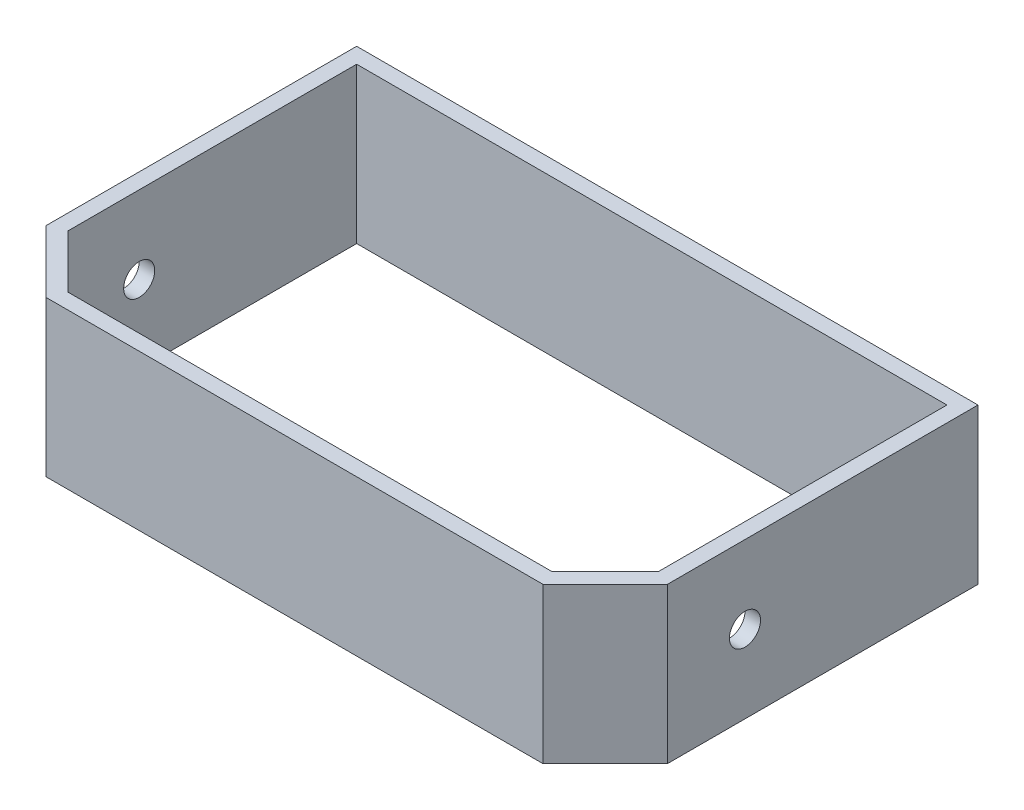
ISO-10303-21;
HEADER;
FILE_DESCRIPTION(('STEP AP214'),'2;1');
FILE_NAME('part.step','',(''),(''),'','','');
FILE_SCHEMA(('AUTOMOTIVE_DESIGN { 1 0 10303 214 1 1 1 1 }'));
ENDSEC;
DATA;
#1=APPLICATION_CONTEXT('core data for automotive mechanical design processes');
#2=APPLICATION_PROTOCOL_DEFINITION('international standard','automotive_design',2000,#1);
#3=PRODUCT_CONTEXT('',#1,'mechanical');
#4=PRODUCT('Part','Part','',(#3));
#5=PRODUCT_RELATED_PRODUCT_CATEGORY('part','',(#4));
#6=PRODUCT_DEFINITION_FORMATION('','',#4);
#7=PRODUCT_DEFINITION_CONTEXT('part definition',#1,'design');
#8=PRODUCT_DEFINITION('design','',#6,#7);
#9=PRODUCT_DEFINITION_SHAPE('','',#8);
#10=(LENGTH_UNIT() NAMED_UNIT(*) SI_UNIT(.MILLI.,.METRE.));
#11=(NAMED_UNIT(*) PLANE_ANGLE_UNIT() SI_UNIT($,.RADIAN.));
#12=(NAMED_UNIT(*) SI_UNIT($,.STERADIAN.) SOLID_ANGLE_UNIT());
#13=UNCERTAINTY_MEASURE_WITH_UNIT(LENGTH_MEASURE(1.E-05),#10,'distance_accuracy_value','');
#14=(GEOMETRIC_REPRESENTATION_CONTEXT(3) GLOBAL_UNCERTAINTY_ASSIGNED_CONTEXT((#13)) GLOBAL_UNIT_ASSIGNED_CONTEXT((#10,
#11,#12)) REPRESENTATION_CONTEXT('',''));
#15=CARTESIAN_POINT('',(0.,0.,0.));
#16=DIRECTION('',(0.,0.,1.));
#17=DIRECTION('',(1.,0.,0.));
#18=AXIS2_PLACEMENT_3D('',#15,#16,#17);
#19=CARTESIAN_POINT('',(0.,15.875,0.));
#20=DIRECTION('',(0.,1.,0.));
#21=DIRECTION('',(0.,0.,1.));
#22=AXIS2_PLACEMENT_3D('',#19,#20,#21);
#23=PLANE('',#22);
#24=DIRECTION('',(0.,0.,1.));
#25=VECTOR('',#24,1.);
#26=CARTESIAN_POINT('',(-63.5,15.875,-12.6999999999999));
#27=LINE('',#26,#25);
#28=CARTESIAN_POINT('',(-63.5,15.875,-76.2));
#29=VERTEX_POINT('',#28);
#30=CARTESIAN_POINT('',(-63.5,15.875,-12.6999999999999));
#31=VERTEX_POINT('',#30);
#32=EDGE_CURVE('E175',#29,#31,#27,.T.);
#33=ORIENTED_EDGE('',*,*,#32,.T.);
#34=DIRECTION('',(0.707106781186551,0.,0.707106781186544));
#35=VECTOR('',#34,1.);
#36=CARTESIAN_POINT('',(-50.8,15.875,0.));
#37=LINE('',#36,#35);
#38=CARTESIAN_POINT('',(-50.8,15.875,0.));
#39=VERTEX_POINT('',#38);
#40=EDGE_CURVE('E178',#31,#39,#37,.T.);
#41=ORIENTED_EDGE('',*,*,#40,.T.);
#42=DIRECTION('',(1.,0.,0.));
#43=VECTOR('',#42,1.);
#44=CARTESIAN_POINT('',(-50.8,15.875,0.));
#45=LINE('',#44,#43);
#46=CARTESIAN_POINT('',(50.8,15.875,0.));
#47=VERTEX_POINT('',#46);
#48=EDGE_CURVE('E181',#39,#47,#45,.T.);
#49=ORIENTED_EDGE('',*,*,#48,.T.);
#50=DIRECTION('',(0.707106781186552,0.,-0.707106781186543));
#51=VECTOR('',#50,1.);
#52=CARTESIAN_POINT('',(50.8,15.875,0.));
#53=LINE('',#52,#51);
#54=CARTESIAN_POINT('',(63.5,15.875,-12.6999999999999));
#55=VERTEX_POINT('',#54);
#56=EDGE_CURVE('E183',#47,#55,#53,.T.);
#57=ORIENTED_EDGE('',*,*,#56,.T.);
#58=DIRECTION('',(0.,0.,-1.));
#59=VECTOR('',#58,1.);
#60=CARTESIAN_POINT('',(63.5,15.875,-12.6999999999999));
#61=LINE('',#60,#59);
#62=CARTESIAN_POINT('',(63.5,15.875,-76.2));
#63=VERTEX_POINT('',#62);
#64=EDGE_CURVE('E185',#55,#63,#61,.T.);
#65=ORIENTED_EDGE('',*,*,#64,.T.);
#66=DIRECTION('',(-1.,0.,0.));
#67=VECTOR('',#66,1.);
#68=CARTESIAN_POINT('',(63.5,15.875,-76.2));
#69=LINE('',#68,#67);
#70=EDGE_CURVE('E187',#63,#29,#69,.T.);
#71=ORIENTED_EDGE('',*,*,#70,.T.);
#72=EDGE_LOOP('',(#33,#41,#49,#57,#65,#71));
#73=FACE_BOUND('',#72,.T.);
#74=DIRECTION('',(-1.,0.,0.));
#75=VECTOR('',#74,1.);
#76=CARTESIAN_POINT('',(60.325,15.875,-73.025));
#77=LINE('',#76,#75);
#78=CARTESIAN_POINT('',(60.325,15.875,-73.025));
#79=VERTEX_POINT('',#78);
#80=CARTESIAN_POINT('',(-60.325,15.875,-73.025));
#81=VERTEX_POINT('',#80);
#82=EDGE_CURVE('E130',#79,#81,#77,.T.);
#83=ORIENTED_EDGE('',*,*,#82,.F.);
#84=DIRECTION('',(0.,0.,-1.));
#85=VECTOR('',#84,1.);
#86=CARTESIAN_POINT('',(60.325,15.875,-14.0151280605346));
#87=LINE('',#86,#85);
#88=CARTESIAN_POINT('',(60.325,15.875,-14.0151280605346));
#89=VERTEX_POINT('',#88);
#90=EDGE_CURVE('E122',#89,#79,#87,.T.);
#91=ORIENTED_EDGE('',*,*,#90,.F.);
#92=DIRECTION('',(0.707106781186548,0.,-0.707106781186547));
#93=VECTOR('',#92,1.);
#94=CARTESIAN_POINT('',(49.4848719394654,15.875,-3.175));
#95=LINE('',#94,#93);
#96=CARTESIAN_POINT('',(49.4848719394654,15.875,-3.175));
#97=VERTEX_POINT('',#96);
#98=EDGE_CURVE('E152',#97,#89,#95,.T.);
#99=ORIENTED_EDGE('',*,*,#98,.F.);
#100=DIRECTION('',(1.,0.,0.));
#101=VECTOR('',#100,1.);
#102=CARTESIAN_POINT('',(-49.4848719394654,15.875,-3.175));
#103=LINE('',#102,#101);
#104=CARTESIAN_POINT('',(-49.4848719394654,15.875,-3.175));
#105=VERTEX_POINT('',#104);
#106=EDGE_CURVE('E150',#105,#97,#103,.T.);
#107=ORIENTED_EDGE('',*,*,#106,.F.);
#108=DIRECTION('',(0.707106781186547,0.,0.707106781186547));
#109=VECTOR('',#108,1.);
#110=CARTESIAN_POINT('',(-49.4848719394654,15.875,-3.175));
#111=LINE('',#110,#109);
#112=CARTESIAN_POINT('',(-60.325,15.875,-14.0151280605346));
#113=VERTEX_POINT('',#112);
#114=EDGE_CURVE('E145',#113,#105,#111,.T.);
#115=ORIENTED_EDGE('',*,*,#114,.F.);
#116=DIRECTION('',(0.,0.,1.));
#117=VECTOR('',#116,1.);
#118=CARTESIAN_POINT('',(-60.325,15.875,-14.0151280605346));
#119=LINE('',#118,#117);
#120=EDGE_CURVE('E143',#81,#113,#119,.T.);
#121=ORIENTED_EDGE('',*,*,#120,.F.);
#122=EDGE_LOOP('',(#83,#91,#99,#107,#115,#121));
#123=FACE_BOUND('',#122,.T.);
#124=ADVANCED_FACE('F33',(#73,#123),#23,.T.);
#125=CARTESIAN_POINT('',(0.,-15.875,0.));
#126=DIRECTION('',(0.,1.,0.));
#127=DIRECTION('',(0.,0.,1.));
#128=AXIS2_PLACEMENT_3D('',#125,#126,#127);
#129=PLANE('',#128);
#130=DIRECTION('',(0.,0.,1.));
#131=VECTOR('',#130,1.);
#132=CARTESIAN_POINT('',(-63.5,-15.875,-12.6999999999999));
#133=LINE('',#132,#131);
#134=CARTESIAN_POINT('',(-63.5,-15.875,-76.2));
#135=VERTEX_POINT('',#134);
#136=CARTESIAN_POINT('',(-63.5,-15.875,-12.6999999999999));
#137=VERTEX_POINT('',#136);
#138=EDGE_CURVE('E138',#135,#137,#133,.T.);
#139=ORIENTED_EDGE('',*,*,#138,.F.);
#140=DIRECTION('',(-1.,0.,0.));
#141=VECTOR('',#140,1.);
#142=CARTESIAN_POINT('',(63.5,-15.875,-76.2));
#143=LINE('',#142,#141);
#144=CARTESIAN_POINT('',(63.5,-15.875,-76.2));
#145=VERTEX_POINT('',#144);
#146=EDGE_CURVE('E179',#145,#135,#143,.T.);
#147=ORIENTED_EDGE('',*,*,#146,.F.);
#148=DIRECTION('',(0.,0.,-1.));
#149=VECTOR('',#148,1.);
#150=CARTESIAN_POINT('',(63.5,-15.875,-12.6999999999999));
#151=LINE('',#150,#149);
#152=CARTESIAN_POINT('',(63.5,-15.875,-12.6999999999999));
#153=VERTEX_POINT('',#152);
#154=EDGE_CURVE('E198',#153,#145,#151,.T.);
#155=ORIENTED_EDGE('',*,*,#154,.F.);
#156=DIRECTION('',(0.707106781186552,0.,-0.707106781186543));
#157=VECTOR('',#156,1.);
#158=CARTESIAN_POINT('',(50.8,-15.875,0.));
#159=LINE('',#158,#157);
#160=CARTESIAN_POINT('',(50.8,-15.875,0.));
#161=VERTEX_POINT('',#160);
#162=EDGE_CURVE('E196',#161,#153,#159,.T.);
#163=ORIENTED_EDGE('',*,*,#162,.F.);
#164=DIRECTION('',(1.,0.,0.));
#165=VECTOR('',#164,1.);
#166=CARTESIAN_POINT('',(-50.8,-15.875,0.));
#167=LINE('',#166,#165);
#168=CARTESIAN_POINT('',(-50.8,-15.875,0.));
#169=VERTEX_POINT('',#168);
#170=EDGE_CURVE('E194',#169,#161,#167,.T.);
#171=ORIENTED_EDGE('',*,*,#170,.F.);
#172=DIRECTION('',(0.707106781186551,0.,0.707106781186544));
#173=VECTOR('',#172,1.);
#174=CARTESIAN_POINT('',(-50.8,-15.875,0.));
#175=LINE('',#174,#173);
#176=EDGE_CURVE('E192',#137,#169,#175,.T.);
#177=ORIENTED_EDGE('',*,*,#176,.F.);
#178=EDGE_LOOP('',(#139,#147,#155,#163,#171,#177));
#179=FACE_BOUND('',#178,.T.);
#180=DIRECTION('',(0.,0.,-1.));
#181=VECTOR('',#180,1.);
#182=CARTESIAN_POINT('',(60.325,-15.875,-14.0151280605346));
#183=LINE('',#182,#181);
#184=CARTESIAN_POINT('',(60.325,-15.875,-14.0151280605346));
#185=VERTEX_POINT('',#184);
#186=CARTESIAN_POINT('',(60.325,-15.875,-73.025));
#187=VERTEX_POINT('',#186);
#188=EDGE_CURVE('E56',#185,#187,#183,.T.);
#189=ORIENTED_EDGE('',*,*,#188,.T.);
#190=DIRECTION('',(-1.,0.,0.));
#191=VECTOR('',#190,1.);
#192=CARTESIAN_POINT('',(60.325,-15.875,-73.025));
#193=LINE('',#192,#191);
#194=CARTESIAN_POINT('',(-60.325,-15.875,-73.025));
#195=VERTEX_POINT('',#194);
#196=EDGE_CURVE('E137',#187,#195,#193,.T.);
#197=ORIENTED_EDGE('',*,*,#196,.T.);
#198=DIRECTION('',(0.,0.,1.));
#199=VECTOR('',#198,1.);
#200=CARTESIAN_POINT('',(-60.325,-15.875,-14.0151280605346));
#201=LINE('',#200,#199);
#202=CARTESIAN_POINT('',(-60.325,-15.875,-14.0151280605346));
#203=VERTEX_POINT('',#202);
#204=EDGE_CURVE('E157',#195,#203,#201,.T.);
#205=ORIENTED_EDGE('',*,*,#204,.T.);
#206=DIRECTION('',(0.707106781186547,0.,0.707106781186547));
#207=VECTOR('',#206,1.);
#208=CARTESIAN_POINT('',(-49.4848719394654,-15.875,-3.175));
#209=LINE('',#208,#207);
#210=CARTESIAN_POINT('',(-49.4848719394654,-15.875,-3.175));
#211=VERTEX_POINT('',#210);
#212=EDGE_CURVE('E160',#203,#211,#209,.T.);
#213=ORIENTED_EDGE('',*,*,#212,.T.);
#214=DIRECTION('',(1.,0.,0.));
#215=VECTOR('',#214,1.);
#216=CARTESIAN_POINT('',(-49.4848719394654,-15.875,-3.175));
#217=LINE('',#216,#215);
#218=CARTESIAN_POINT('',(49.4848719394654,-15.875,-3.175));
#219=VERTEX_POINT('',#218);
#220=EDGE_CURVE('E163',#211,#219,#217,.T.);
#221=ORIENTED_EDGE('',*,*,#220,.T.);
#222=DIRECTION('',(0.707106781186548,0.,-0.707106781186547));
#223=VECTOR('',#222,1.);
#224=CARTESIAN_POINT('',(49.4848719394654,-15.875,-3.175));
#225=LINE('',#224,#223);
#226=EDGE_CURVE('E131',#219,#185,#225,.T.);
#227=ORIENTED_EDGE('',*,*,#226,.T.);
#228=EDGE_LOOP('',(#189,#197,#205,#213,#221,#227));
#229=FACE_BOUND('',#228,.T.);
#230=ADVANCED_FACE('F222',(#179,#229),#129,.F.);
#231=CARTESIAN_POINT('',(-63.5,15.875,-12.6999999999999));
#232=DIRECTION('',(1.,0.,0.));
#233=DIRECTION('',(0.,0.,-1.));
#234=AXIS2_PLACEMENT_3D('',#231,#232,#233);
#235=PLANE('',#234);
#236=CARTESIAN_POINT('',(-63.5,0.,-28.5749999999999));
#237=DIRECTION('',(-1.,0.,0.));
#238=DIRECTION('',(0.,0.,1.));
#239=AXIS2_PLACEMENT_3D('',#236,#237,#238);
#240=CIRCLE('',#239,3.175);
#241=CARTESIAN_POINT('',(-63.5,0.,-25.3999999999999));
#242=VERTEX_POINT('',#241);
#243=EDGE_CURVE('E155',#242,#242,#240,.T.);
#244=ORIENTED_EDGE('',*,*,#243,.F.);
#245=EDGE_LOOP('',(#244));
#246=FACE_BOUND('',#245,.T.);
#247=ORIENTED_EDGE('',*,*,#138,.T.);
#248=DIRECTION('',(0.,-1.,0.));
#249=VECTOR('',#248,1.);
#250=CARTESIAN_POINT('',(-63.5,15.875,-12.6999999999999));
#251=LINE('',#250,#249);
#252=EDGE_CURVE('E11',#31,#137,#251,.T.);
#253=ORIENTED_EDGE('',*,*,#252,.F.);
#254=ORIENTED_EDGE('',*,*,#32,.F.);
#255=DIRECTION('',(0.,-1.,0.));
#256=VECTOR('',#255,1.);
#257=CARTESIAN_POINT('',(-63.5,15.875,-76.2));
#258=LINE('',#257,#256);
#259=EDGE_CURVE('E189',#29,#135,#258,.T.);
#260=ORIENTED_EDGE('',*,*,#259,.T.);
#261=EDGE_LOOP('',(#247,#253,#254,#260));
#262=FACE_BOUND('',#261,.T.);
#263=ADVANCED_FACE('F35',(#246,#262),#235,.F.);
#264=CARTESIAN_POINT('',(-50.8,15.875,0.));
#265=DIRECTION('',(0.707106781186544,0.,-0.707106781186551));
#266=DIRECTION('',(-0.707106781186551,0.,-0.707106781186544));
#267=AXIS2_PLACEMENT_3D('',#264,#265,#266);
#268=PLANE('',#267);
#269=ORIENTED_EDGE('',*,*,#176,.T.);
#270=DIRECTION('',(0.,-1.,0.));
#271=VECTOR('',#270,1.);
#272=CARTESIAN_POINT('',(-50.8,15.875,0.));
#273=LINE('',#272,#271);
#274=EDGE_CURVE('E41',#39,#169,#273,.T.);
#275=ORIENTED_EDGE('',*,*,#274,.F.);
#276=ORIENTED_EDGE('',*,*,#40,.F.);
#277=ORIENTED_EDGE('',*,*,#252,.T.);
#278=EDGE_LOOP('',(#269,#275,#276,#277));
#279=FACE_BOUND('',#278,.T.);
#280=ADVANCED_FACE('F239',(#279),#268,.F.);
#281=CARTESIAN_POINT('',(-50.8,15.875,0.));
#282=DIRECTION('',(0.,0.,-1.));
#283=DIRECTION('',(-1.,0.,0.));
#284=AXIS2_PLACEMENT_3D('',#281,#282,#283);
#285=PLANE('',#284);
#286=ORIENTED_EDGE('',*,*,#170,.T.);
#287=DIRECTION('',(0.,-1.,0.));
#288=VECTOR('',#287,1.);
#289=CARTESIAN_POINT('',(50.8,15.875,0.));
#290=LINE('',#289,#288);
#291=EDGE_CURVE('E209',#47,#161,#290,.T.);
#292=ORIENTED_EDGE('',*,*,#291,.F.);
#293=ORIENTED_EDGE('',*,*,#48,.F.);
#294=ORIENTED_EDGE('',*,*,#274,.T.);
#295=EDGE_LOOP('',(#286,#292,#293,#294));
#296=FACE_BOUND('',#295,.T.);
#297=ADVANCED_FACE('F216',(#296),#285,.F.);
#298=CARTESIAN_POINT('',(50.8,15.875,0.));
#299=DIRECTION('',(-0.707106781186543,0.,-0.707106781186552));
#300=DIRECTION('',(-0.707106781186552,0.,0.707106781186543));
#301=AXIS2_PLACEMENT_3D('',#298,#299,#300);
#302=PLANE('',#301);
#303=ORIENTED_EDGE('',*,*,#162,.T.);
#304=DIRECTION('',(0.,-1.,0.));
#305=VECTOR('',#304,1.);
#306=CARTESIAN_POINT('',(63.5,15.875,-12.6999999999999));
#307=LINE('',#306,#305);
#308=EDGE_CURVE('E206',#55,#153,#307,.T.);
#309=ORIENTED_EDGE('',*,*,#308,.F.);
#310=ORIENTED_EDGE('',*,*,#56,.F.);
#311=ORIENTED_EDGE('',*,*,#291,.T.);
#312=EDGE_LOOP('',(#303,#309,#310,#311));
#313=FACE_BOUND('',#312,.T.);
#314=ADVANCED_FACE('F228',(#313),#302,.F.);
#315=CARTESIAN_POINT('',(63.5,15.875,-12.6999999999999));
#316=DIRECTION('',(-1.,0.,0.));
#317=DIRECTION('',(0.,0.,1.));
#318=AXIS2_PLACEMENT_3D('',#315,#316,#317);
#319=PLANE('',#318);
#320=CARTESIAN_POINT('',(63.5,0.,-28.5749999999999));
#321=DIRECTION('',(1.,0.,0.));
#322=DIRECTION('',(0.,0.,-1.));
#323=AXIS2_PLACEMENT_3D('',#320,#321,#322);
#324=CIRCLE('',#323,3.175);
#325=CARTESIAN_POINT('',(63.5,0.,-31.7499999999999));
#326=VERTEX_POINT('',#325);
#327=EDGE_CURVE('E292',#326,#326,#324,.T.);
#328=ORIENTED_EDGE('',*,*,#327,.F.);
#329=EDGE_LOOP('',(#328));
#330=FACE_BOUND('',#329,.T.);
#331=ORIENTED_EDGE('',*,*,#154,.T.);
#332=DIRECTION('',(0.,-1.,0.));
#333=VECTOR('',#332,1.);
#334=CARTESIAN_POINT('',(63.5,15.875,-76.2));
#335=LINE('',#334,#333);
#336=EDGE_CURVE('E203',#63,#145,#335,.T.);
#337=ORIENTED_EDGE('',*,*,#336,.F.);
#338=ORIENTED_EDGE('',*,*,#64,.F.);
#339=ORIENTED_EDGE('',*,*,#308,.T.);
#340=EDGE_LOOP('',(#331,#337,#338,#339));
#341=FACE_BOUND('',#340,.T.);
#342=ADVANCED_FACE('F232',(#330,#341),#319,.F.);
#343=CARTESIAN_POINT('',(63.5,15.875,-76.2));
#344=DIRECTION('',(0.,0.,1.));
#345=DIRECTION('',(1.,0.,0.));
#346=AXIS2_PLACEMENT_3D('',#343,#344,#345);
#347=PLANE('',#346);
#348=ORIENTED_EDGE('',*,*,#146,.T.);
#349=ORIENTED_EDGE('',*,*,#259,.F.);
#350=ORIENTED_EDGE('',*,*,#70,.F.);
#351=ORIENTED_EDGE('',*,*,#336,.T.);
#352=EDGE_LOOP('',(#348,#349,#350,#351));
#353=FACE_BOUND('',#352,.T.);
#354=ADVANCED_FACE('F242',(#353),#347,.F.);
#355=CARTESIAN_POINT('',(60.325,15.875,-14.0151280605346));
#356=DIRECTION('',(-1.,0.,0.));
#357=DIRECTION('',(0.,0.,1.));
#358=AXIS2_PLACEMENT_3D('',#355,#356,#357);
#359=PLANE('',#358);
#360=CARTESIAN_POINT('',(60.325,0.,-28.5749999999999));
#361=DIRECTION('',(-1.,0.,0.));
#362=DIRECTION('',(0.,0.,1.));
#363=AXIS2_PLACEMENT_3D('',#360,#361,#362);
#364=CIRCLE('',#363,3.175);
#365=CARTESIAN_POINT('',(60.325,0.,-25.3999999999999));
#366=VERTEX_POINT('',#365);
#367=EDGE_CURVE('E289',#366,#366,#364,.F.);
#368=ORIENTED_EDGE('',*,*,#367,.T.);
#369=EDGE_LOOP('',(#368));
#370=FACE_BOUND('',#369,.T.);
#371=ORIENTED_EDGE('',*,*,#188,.F.);
#372=DIRECTION('',(0.,-1.,0.));
#373=VECTOR('',#372,1.);
#374=CARTESIAN_POINT('',(60.325,15.875,-14.0151280605346));
#375=LINE('',#374,#373);
#376=EDGE_CURVE('E126',#89,#185,#375,.T.);
#377=ORIENTED_EDGE('',*,*,#376,.F.);
#378=ORIENTED_EDGE('',*,*,#90,.T.);
#379=DIRECTION('',(0.,-1.,0.));
#380=VECTOR('',#379,1.);
#381=CARTESIAN_POINT('',(60.325,15.875,-73.025));
#382=LINE('',#381,#380);
#383=EDGE_CURVE('E125',#79,#187,#382,.T.);
#384=ORIENTED_EDGE('',*,*,#383,.T.);
#385=EDGE_LOOP('',(#371,#377,#378,#384));
#386=FACE_BOUND('',#385,.T.);
#387=ADVANCED_FACE('F124',(#370,#386),#359,.T.);
#388=CARTESIAN_POINT('',(60.325,15.875,-73.025));
#389=DIRECTION('',(0.,0.,1.));
#390=DIRECTION('',(1.,0.,0.));
#391=AXIS2_PLACEMENT_3D('',#388,#389,#390);
#392=PLANE('',#391);
#393=ORIENTED_EDGE('',*,*,#196,.F.);
#394=ORIENTED_EDGE('',*,*,#383,.F.);
#395=ORIENTED_EDGE('',*,*,#82,.T.);
#396=DIRECTION('',(0.,-1.,0.));
#397=VECTOR('',#396,1.);
#398=CARTESIAN_POINT('',(-60.325,15.875,-73.025));
#399=LINE('',#398,#397);
#400=EDGE_CURVE('E139',#81,#195,#399,.T.);
#401=ORIENTED_EDGE('',*,*,#400,.T.);
#402=EDGE_LOOP('',(#393,#394,#395,#401));
#403=FACE_BOUND('',#402,.T.);
#404=ADVANCED_FACE('F134',(#403),#392,.T.);
#405=CARTESIAN_POINT('',(-60.325,15.875,-14.0151280605346));
#406=DIRECTION('',(1.,0.,0.));
#407=DIRECTION('',(0.,0.,-1.));
#408=AXIS2_PLACEMENT_3D('',#405,#406,#407);
#409=PLANE('',#408);
#410=CARTESIAN_POINT('',(-60.325,0.,-28.5749999999999));
#411=DIRECTION('',(1.,0.,0.));
#412=DIRECTION('',(0.,0.,-1.));
#413=AXIS2_PLACEMENT_3D('',#410,#411,#412);
#414=CIRCLE('',#413,3.175);
#415=CARTESIAN_POINT('',(-60.325,0.,-31.7499999999999));
#416=VERTEX_POINT('',#415);
#417=EDGE_CURVE('E293',#416,#416,#414,.F.);
#418=ORIENTED_EDGE('',*,*,#417,.T.);
#419=EDGE_LOOP('',(#418));
#420=FACE_BOUND('',#419,.T.);
#421=ORIENTED_EDGE('',*,*,#204,.F.);
#422=ORIENTED_EDGE('',*,*,#400,.F.);
#423=ORIENTED_EDGE('',*,*,#120,.T.);
#424=DIRECTION('',(0.,-1.,0.));
#425=VECTOR('',#424,1.);
#426=CARTESIAN_POINT('',(-60.325,15.875,-14.0151280605346));
#427=LINE('',#426,#425);
#428=EDGE_CURVE('E172',#113,#203,#427,.T.);
#429=ORIENTED_EDGE('',*,*,#428,.T.);
#430=EDGE_LOOP('',(#421,#422,#423,#429));
#431=FACE_BOUND('',#430,.T.);
#432=ADVANCED_FACE('F262',(#420,#431),#409,.T.);
#433=CARTESIAN_POINT('',(-49.4848719394654,15.875,-3.175));
#434=DIRECTION('',(0.707106781186548,0.,-0.707106781186548));
#435=DIRECTION('',(-0.707106781186548,0.,-0.707106781186548));
#436=AXIS2_PLACEMENT_3D('',#433,#434,#435);
#437=PLANE('',#436);
#438=ORIENTED_EDGE('',*,*,#212,.F.);
#439=ORIENTED_EDGE('',*,*,#428,.F.);
#440=ORIENTED_EDGE('',*,*,#114,.T.);
#441=DIRECTION('',(0.,-1.,0.));
#442=VECTOR('',#441,1.);
#443=CARTESIAN_POINT('',(-49.4848719394654,15.875,-3.175));
#444=LINE('',#443,#442);
#445=EDGE_CURVE('E170',#105,#211,#444,.T.);
#446=ORIENTED_EDGE('',*,*,#445,.T.);
#447=EDGE_LOOP('',(#438,#439,#440,#446));
#448=FACE_BOUND('',#447,.T.);
#449=ADVANCED_FACE('F265',(#448),#437,.T.);
#450=CARTESIAN_POINT('',(-49.4848719394654,15.875,-3.175));
#451=DIRECTION('',(0.,0.,-1.));
#452=DIRECTION('',(-1.,0.,0.));
#453=AXIS2_PLACEMENT_3D('',#450,#451,#452);
#454=PLANE('',#453);
#455=ORIENTED_EDGE('',*,*,#220,.F.);
#456=ORIENTED_EDGE('',*,*,#445,.F.);
#457=ORIENTED_EDGE('',*,*,#106,.T.);
#458=DIRECTION('',(0.,-1.,0.));
#459=VECTOR('',#458,1.);
#460=CARTESIAN_POINT('',(49.4848719394654,15.875,-3.175));
#461=LINE('',#460,#459);
#462=EDGE_CURVE('E48',#97,#219,#461,.T.);
#463=ORIENTED_EDGE('',*,*,#462,.T.);
#464=EDGE_LOOP('',(#455,#456,#457,#463));
#465=FACE_BOUND('',#464,.T.);
#466=ADVANCED_FACE('F269',(#465),#454,.T.);
#467=CARTESIAN_POINT('',(49.4848719394654,15.875,-3.175));
#468=DIRECTION('',(-0.707106781186547,0.,-0.707106781186548));
#469=DIRECTION('',(-0.707106781186548,0.,0.707106781186547));
#470=AXIS2_PLACEMENT_3D('',#467,#468,#469);
#471=PLANE('',#470);
#472=ORIENTED_EDGE('',*,*,#226,.F.);
#473=ORIENTED_EDGE('',*,*,#462,.F.);
#474=ORIENTED_EDGE('',*,*,#98,.T.);
#475=ORIENTED_EDGE('',*,*,#376,.T.);
#476=EDGE_LOOP('',(#472,#473,#474,#475));
#477=FACE_BOUND('',#476,.T.);
#478=ADVANCED_FACE('F273',(#477),#471,.T.);
#479=CARTESIAN_POINT('',(63.501,0.,-28.5749999999999));
#480=DIRECTION('',(-1.,0.,0.));
#481=DIRECTION('',(0.,0.,1.));
#482=AXIS2_PLACEMENT_3D('',#479,#480,#481);
#483=CYLINDRICAL_SURFACE('',#482,3.175);
#484=ORIENTED_EDGE('',*,*,#417,.F.);
#485=EDGE_LOOP('',(#484));
#486=FACE_BOUND('',#485,.T.);
#487=ORIENTED_EDGE('',*,*,#243,.T.);
#488=EDGE_LOOP('',(#487));
#489=FACE_BOUND('',#488,.T.);
#490=ADVANCED_FACE('F277',(#486,#489),#483,.F.);
#491=CARTESIAN_POINT('',(-63.501,0.,-28.5749999999999));
#492=DIRECTION('',(1.,0.,0.));
#493=DIRECTION('',(0.,0.,-1.));
#494=AXIS2_PLACEMENT_3D('',#491,#492,#493);
#495=CYLINDRICAL_SURFACE('',#494,3.175);
#496=ORIENTED_EDGE('',*,*,#367,.F.);
#497=EDGE_LOOP('',(#496));
#498=FACE_BOUND('',#497,.T.);
#499=ORIENTED_EDGE('',*,*,#327,.T.);
#500=EDGE_LOOP('',(#499));
#501=FACE_BOUND('',#500,.T.);
#502=ADVANCED_FACE('F280',(#498,#501),#495,.F.);
#503=CLOSED_SHELL('',(#124,#230,#263,#280,#297,#314,#342,#354,#387,#404,#432,#449,#466,#478,
#490,#502));
#504=MANIFOLD_SOLID_BREP('B2',#503);
#505=ADVANCED_BREP_SHAPE_REPRESENTATION('',(#18,#504),#14);
#506=SHAPE_DEFINITION_REPRESENTATION(#9,#505);
ENDSEC;
END-ISO-10303-21;
